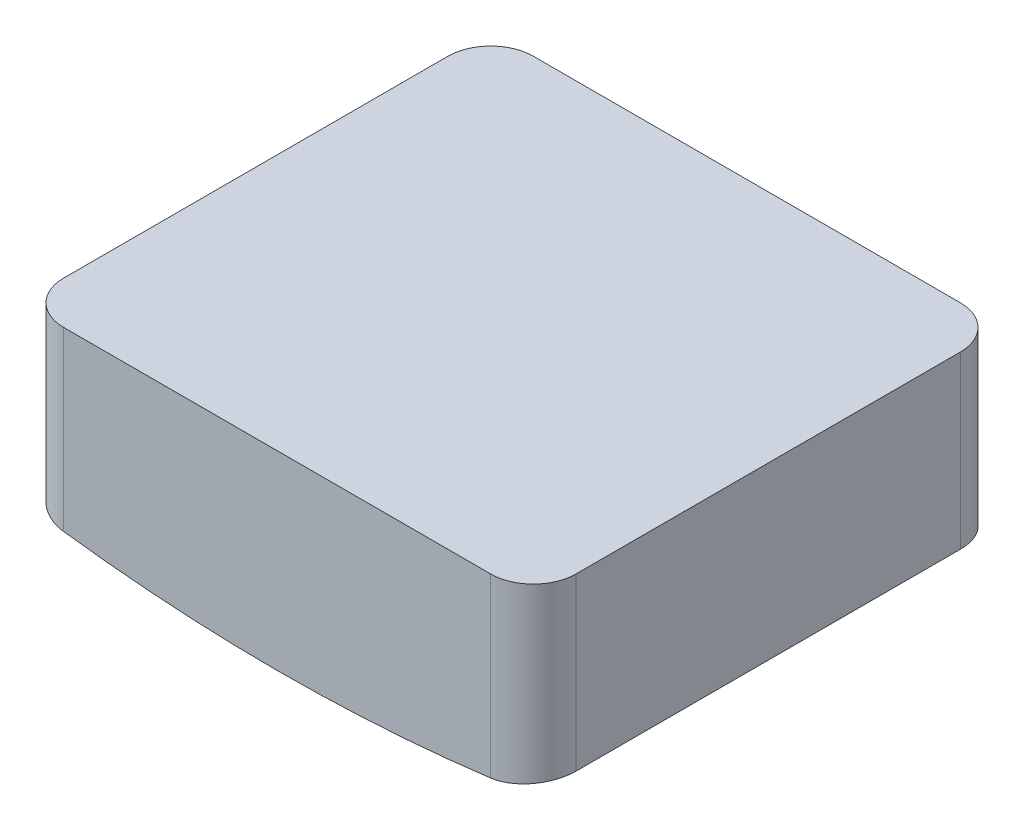
ISO-10303-21;
HEADER;
FILE_DESCRIPTION(('STEP AP214'),'2;1');
FILE_NAME('part.step','',(''),(''),'','','');
FILE_SCHEMA(('AUTOMOTIVE_DESIGN { 1 0 10303 214 1 1 1 1 }'));
ENDSEC;
DATA;
#1=APPLICATION_CONTEXT('core data for automotive mechanical design processes');
#2=APPLICATION_PROTOCOL_DEFINITION('international standard','automotive_design',2000,#1);
#3=PRODUCT_CONTEXT('',#1,'mechanical');
#4=PRODUCT('Part','Part','',(#3));
#5=PRODUCT_RELATED_PRODUCT_CATEGORY('part','',(#4));
#6=PRODUCT_DEFINITION_FORMATION('','',#4);
#7=PRODUCT_DEFINITION_CONTEXT('part definition',#1,'design');
#8=PRODUCT_DEFINITION('design','',#6,#7);
#9=PRODUCT_DEFINITION_SHAPE('','',#8);
#10=(LENGTH_UNIT() NAMED_UNIT(*) SI_UNIT(.MILLI.,.METRE.));
#11=(NAMED_UNIT(*) PLANE_ANGLE_UNIT() SI_UNIT($,.RADIAN.));
#12=(NAMED_UNIT(*) SI_UNIT($,.STERADIAN.) SOLID_ANGLE_UNIT());
#13=UNCERTAINTY_MEASURE_WITH_UNIT(LENGTH_MEASURE(1.E-05),#10,'distance_accuracy_value','');
#14=(GEOMETRIC_REPRESENTATION_CONTEXT(3) GLOBAL_UNCERTAINTY_ASSIGNED_CONTEXT((#13)) GLOBAL_UNIT_ASSIGNED_CONTEXT((#10,
#11,#12)) REPRESENTATION_CONTEXT('',''));
#15=CARTESIAN_POINT('',(0.,0.,0.));
#16=DIRECTION('',(0.,0.,1.));
#17=DIRECTION('',(1.,0.,0.));
#18=AXIS2_PLACEMENT_3D('',#15,#16,#17);
#19=CARTESIAN_POINT('',(31.567828207483,156.431270726947,5.));
#20=DIRECTION('',(0.,-1.,0.));
#21=DIRECTION('',(1.,0.,0.));
#22=AXIS2_PLACEMENT_3D('',#19,#20,#21);
#23=CYLINDRICAL_SURFACE('',#22,0.5);
#24=CARTESIAN_POINT('',(31.067828207483,136.910448510657,5.));
#25=CARTESIAN_POINT('',(31.0678032975781,136.910454043257,5.02790465586651));
#26=CARTESIAN_POINT('',(31.0701626651733,136.910089770888,5.05579993611413));
#27=CARTESIAN_POINT('',(31.0794634270095,136.908662918999,5.11076602421062));
#28=CARTESIAN_POINT('',(31.086399567339,136.907601140188,5.13783774023811));
#29=CARTESIAN_POINT('',(31.1046713242411,136.904819917588,5.19042768650378));
#30=CARTESIAN_POINT('',(31.1160084808209,136.903100243592,5.21594536933346));
#31=CARTESIAN_POINT('',(31.1427363332979,136.899078820125,5.26470631782095));
#32=CARTESIAN_POINT('',(31.1581267463067,136.896777111278,5.2879497420506));
#33=CARTESIAN_POINT('',(31.1926129354921,136.891671411549,5.33165153904714));
#34=CARTESIAN_POINT('',(31.2117288639906,136.88886469559,5.3520936857605));
#35=CARTESIAN_POINT('',(31.2530672182779,136.882867824658,5.38949003441723));
#36=CARTESIAN_POINT('',(31.2752903400118,136.879677583807,5.40644345285122));
#37=CARTESIAN_POINT('',(31.3224675104551,136.872997090204,5.43656617270208));
#38=CARTESIAN_POINT('',(31.3474483124578,136.869503984696,5.44969290197451));
#39=CARTESIAN_POINT('',(31.3992366962916,136.862371908969,5.47155692620132));
#40=CARTESIAN_POINT('',(31.426043390455,136.858733009979,5.48029633702002));
#41=CARTESIAN_POINT('',(31.4721261320835,136.852578506811,5.49113413004448));
#42=CARTESIAN_POINT('',(31.4911245310734,136.850068873877,5.49445602988902));
#43=CARTESIAN_POINT('',(31.5293542187095,136.84507596698,5.49888887726439));
#44=CARTESIAN_POINT('',(31.5485851554473,136.84259266181,5.50000282584829));
#45=CARTESIAN_POINT('',(31.567828207483,136.840137528482,5.5));
#46=B_SPLINE_CURVE_WITH_KNOTS('',3,(#24,#25,#26,#27,#28,#29,#30,#31,#32,#33,#34,#35,#36,#37,#38,
#39,#40,#41,#42,#43,#44,#45),.UNSPECIFIED.,.F.,.F.,(4,2,2,2,2,2,2,2,2,2,4),(0.,
0.0835981765681816,0.167100553081682,0.25063217519107,0.334157968931885,0.418148787090127,
0.502158447629228,0.587069869496855,0.671940301849044,0.730168364448781,0.788317228894858),.UNSPECIFIED.);
#47=CARTESIAN_POINT('',(31.067828207483,136.910448510657,5.));
#48=VERTEX_POINT('',#47);
#49=CARTESIAN_POINT('',(31.567828207483,136.840137528482,5.5));
#50=VERTEX_POINT('',#49);
#51=EDGE_CURVE('E21',#48,#50,#46,.T.);
#52=ORIENTED_EDGE('',*,*,#51,.T.);
#53=DIRECTION('',(0.,1.,0.));
#54=VECTOR('',#53,1.);
#55=CARTESIAN_POINT('',(31.5678282074829,156.431270726947,5.5));
#56=LINE('',#55,#54);
#57=CARTESIAN_POINT('',(31.5678282074829,138.910448510656,5.5));
#58=VERTEX_POINT('',#57);
#59=EDGE_CURVE('E132',#58,#50,#56,.F.);
#60=ORIENTED_EDGE('',*,*,#59,.F.);
#61=CARTESIAN_POINT('',(31.567828207483,138.910448510656,5.));
#62=DIRECTION('',(0.,-1.,0.));
#63=DIRECTION('',(1.,0.,0.));
#64=AXIS2_PLACEMENT_3D('',#61,#62,#63);
#65=CIRCLE('',#64,0.5);
#66=CARTESIAN_POINT('',(31.0678282074829,138.910448510656,5.));
#67=VERTEX_POINT('',#66);
#68=EDGE_CURVE('E143',#58,#67,#65,.T.);
#69=ORIENTED_EDGE('',*,*,#68,.T.);
#70=DIRECTION('',(0.,1.,0.));
#71=VECTOR('',#70,1.);
#72=CARTESIAN_POINT('',(31.0678282074829,138.910448510656,5.));
#73=LINE('',#72,#71);
#74=EDGE_CURVE('E116',#67,#48,#73,.F.);
#75=ORIENTED_EDGE('',*,*,#74,.T.);
#76=EDGE_LOOP('',(#52,#60,#69,#75));
#77=FACE_BOUND('',#76,.T.);
#78=ADVANCED_FACE('F17',(#77),#23,.T.);
#79=CARTESIAN_POINT('',(31.5678282074829,138.910448510656,0.5));
#80=DIRECTION('',(0.,1.,0.));
#81=DIRECTION('',(-1.,0.,0.));
#82=AXIS2_PLACEMENT_3D('',#79,#80,#81);
#83=CYLINDRICAL_SURFACE('',#82,0.5);
#84=CARTESIAN_POINT('',(31.567828207483,136.840137528482,0.));
#85=CARTESIAN_POINT('',(31.5394774338303,136.843752928276,-2.27791891081046E-05));
#86=CARTESIAN_POINT('',(31.5111422334126,136.84743362887,0.00240990943797193));
#87=CARTESIAN_POINT('',(31.4553040964931,136.854805641174,0.0120100811325862));
#88=CARTESIAN_POINT('',(31.4278006620447,136.858496945026,0.0191746702646636));
#89=CARTESIAN_POINT('',(31.3743775409306,136.865776660512,0.0380675220646654));
#90=CARTESIAN_POINT('',(31.348458636155,136.869365020892,0.049798017091667));
#91=CARTESIAN_POINT('',(31.2989617774437,136.876309666888,0.0774903425616476));
#92=CARTESIAN_POINT('',(31.2753833405934,136.879666000335,0.0934512976187248));
#93=CARTESIAN_POINT('',(31.2312943775798,136.886013701917,0.129126164369394));
#94=CARTESIAN_POINT('',(31.2107769227569,136.889005891387,0.148831363455944));
#95=CARTESIAN_POINT('',(31.1733446179727,136.894515019627,0.191475273877057));
#96=CARTESIAN_POINT('',(31.1564303728705,136.897031878596,0.21441452702929));
#97=CARTESIAN_POINT('',(31.1268470881303,136.901463950448,0.262660840213983));
#98=CARTESIAN_POINT('',(31.1141428712893,136.90338413996,0.28794589680137));
#99=CARTESIAN_POINT('',(31.0931728013977,136.90656743749,0.340323733079197));
#100=CARTESIAN_POINT('',(31.0849036449686,136.907831034538,0.367415150375042));
#101=CARTESIAN_POINT('',(31.0752717295329,136.909305674365,0.412249624095177));
#102=CARTESIAN_POINT('',(31.0724821441606,136.909733698535,0.429692035087494));
#103=CARTESIAN_POINT('',(31.0687607323034,136.910305192721,0.464753646070963));
#104=CARTESIAN_POINT('',(31.0678262993431,136.910449061971,0.482372563018321));
#105=CARTESIAN_POINT('',(31.0678282074829,136.910448510657,0.5));
#106=B_SPLINE_CURVE_WITH_KNOTS('',3,(#84,#85,#86,#87,#88,#89,#90,#91,#92,#93,#94,#95,#96,#97,
#98,#99,#100,#101,#102,#103,#104,#105),.UNSPECIFIED.,.F.,.F.,(4,2,2,2,2,2,2,2,2,2,4),(0.,
0.085627645082959,0.17120297044795,0.256820187894299,0.342419702851598,0.427822420056795,
0.513239462257654,0.597923658504689,0.682544691280089,0.735459468230943,0.788299847549629),.UNSPECIFIED.);
#107=CARTESIAN_POINT('',(31.567828207483,136.840137528482,0.));
#108=VERTEX_POINT('',#107);
#109=CARTESIAN_POINT('',(31.0678282074829,136.910448510657,0.5));
#110=VERTEX_POINT('',#109);
#111=EDGE_CURVE('E163',#108,#110,#106,.T.);
#112=ORIENTED_EDGE('',*,*,#111,.T.);
#113=DIRECTION('',(0.,1.,0.));
#114=VECTOR('',#113,1.);
#115=CARTESIAN_POINT('',(31.0678282074829,138.910448510656,0.5));
#116=LINE('',#115,#114);
#117=CARTESIAN_POINT('',(31.0678282074829,138.910448510656,0.5));
#118=VERTEX_POINT('',#117);
#119=EDGE_CURVE('E129',#110,#118,#116,.T.);
#120=ORIENTED_EDGE('',*,*,#119,.T.);
#121=CARTESIAN_POINT('',(31.5678282074829,138.910448510656,0.5));
#122=DIRECTION('',(0.,1.,0.));
#123=DIRECTION('',(-1.,0.,0.));
#124=AXIS2_PLACEMENT_3D('',#121,#122,#123);
#125=CIRCLE('',#124,0.5);
#126=CARTESIAN_POINT('',(31.5678282074829,138.910448510656,0.));
#127=VERTEX_POINT('',#126);
#128=EDGE_CURVE('E96',#118,#127,#125,.F.);
#129=ORIENTED_EDGE('',*,*,#128,.T.);
#130=DIRECTION('',(0.,1.,0.));
#131=VECTOR('',#130,1.);
#132=CARTESIAN_POINT('',(31.5678282074829,156.431270726947,0.));
#133=LINE('',#132,#131);
#134=EDGE_CURVE('E119',#127,#108,#133,.F.);
#135=ORIENTED_EDGE('',*,*,#134,.T.);
#136=EDGE_LOOP('',(#112,#120,#129,#135));
#137=FACE_BOUND('',#136,.T.);
#138=ADVANCED_FACE('F167',(#137),#83,.T.);
#139=CARTESIAN_POINT('',(36.5678282074829,156.431270726947,5.));
#140=DIRECTION('',(0.,1.,0.));
#141=DIRECTION('',(0.,0.,1.));
#142=AXIS2_PLACEMENT_3D('',#139,#140,#141);
#143=CYLINDRICAL_SURFACE('',#142,0.5);
#144=CARTESIAN_POINT('',(36.5678282074829,138.910448510656,5.));
#145=DIRECTION('',(0.,1.,0.));
#146=DIRECTION('',(0.,0.,1.));
#147=AXIS2_PLACEMENT_3D('',#144,#145,#146);
#148=CIRCLE('',#147,0.5);
#149=CARTESIAN_POINT('',(37.0678282074829,138.910448510656,5.));
#150=VERTEX_POINT('',#149);
#151=CARTESIAN_POINT('',(36.5678282074829,138.910448510656,5.5));
#152=VERTEX_POINT('',#151);
#153=EDGE_CURVE('E211',#150,#152,#148,.F.);
#154=ORIENTED_EDGE('',*,*,#153,.T.);
#155=DIRECTION('',(0.,1.,0.));
#156=VECTOR('',#155,1.);
#157=CARTESIAN_POINT('',(36.5678282074829,156.431270726947,5.5));
#158=LINE('',#157,#156);
#159=CARTESIAN_POINT('',(36.5678282074828,136.840137528482,5.5));
#160=VERTEX_POINT('',#159);
#161=EDGE_CURVE('E204',#160,#152,#158,.T.);
#162=ORIENTED_EDGE('',*,*,#161,.F.);
#163=CARTESIAN_POINT('',(36.5678282074828,136.840137528482,5.5));
#164=CARTESIAN_POINT('',(36.5961789811355,136.843752928276,5.50002277918911));
#165=CARTESIAN_POINT('',(36.6245141815532,136.84743362887,5.49759009056203));
#166=CARTESIAN_POINT('',(36.6803523184727,136.854805641174,5.48798991886741));
#167=CARTESIAN_POINT('',(36.7078557529211,136.858496945026,5.48082532973534));
#168=CARTESIAN_POINT('',(36.7612788740352,136.865776660512,5.46193247793533));
#169=CARTESIAN_POINT('',(36.7871977788108,136.869365020892,5.45020198290833));
#170=CARTESIAN_POINT('',(36.8366946375221,136.876309666888,5.42250965743835));
#171=CARTESIAN_POINT('',(36.8602730743724,136.879666000335,5.40654870238127));
#172=CARTESIAN_POINT('',(36.904362037386,136.886013701917,5.3708738356306));
#173=CARTESIAN_POINT('',(36.9248794922089,136.889005891387,5.35116863654405));
#174=CARTESIAN_POINT('',(36.9623117969931,136.894515019627,5.30852472612294));
#175=CARTESIAN_POINT('',(36.9792260420953,136.897031878596,5.2855854729707));
#176=CARTESIAN_POINT('',(37.0088093268355,136.901463950448,5.23733915978601));
#177=CARTESIAN_POINT('',(37.0215135436764,136.90338413996,5.21205410319863));
#178=CARTESIAN_POINT('',(37.0424836135681,136.90656743749,5.1596762669208));
#179=CARTESIAN_POINT('',(37.0507527699971,136.907831034538,5.13258484962495));
#180=CARTESIAN_POINT('',(37.0603846854329,136.909305674365,5.08775037590482));
#181=CARTESIAN_POINT('',(37.0631742708052,136.909733698535,5.0703079649125));
#182=CARTESIAN_POINT('',(37.0668956826624,136.910305192721,5.03524635392904));
#183=CARTESIAN_POINT('',(37.0678301156227,136.910449061971,5.01762743698168));
#184=CARTESIAN_POINT('',(37.0678282074829,136.910448510657,5.));
#185=B_SPLINE_CURVE_WITH_KNOTS('',3,(#163,#164,#165,#166,#167,#168,#169,#170,#171,#172,#173,
#174,#175,#176,#177,#178,#179,#180,#181,#182,#183,#184),.UNSPECIFIED.,.F.,.F.,(4,2,2,2,2,2,2,2,
2,2,4),(0.,0.0856276450829589,0.171202970447957,0.256820187894306,0.342419702851605,
0.427822420056807,0.513239462257661,0.597923658504699,0.682544691280097,0.735459468230948,
0.788299847549631),.UNSPECIFIED.);
#186=CARTESIAN_POINT('',(37.0678282074829,136.910448510657,5.));
#187=VERTEX_POINT('',#186);
#188=EDGE_CURVE('E40',#160,#187,#185,.T.);
#189=ORIENTED_EDGE('',*,*,#188,.T.);
#190=DIRECTION('',(0.,1.,0.));
#191=VECTOR('',#190,1.);
#192=CARTESIAN_POINT('',(37.0678282074829,136.910448510656,5.));
#193=LINE('',#192,#191);
#194=EDGE_CURVE('E121',#187,#150,#193,.T.);
#195=ORIENTED_EDGE('',*,*,#194,.T.);
#196=EDGE_LOOP('',(#154,#162,#189,#195));
#197=FACE_BOUND('',#196,.T.);
#198=ADVANCED_FACE('F170',(#197),#143,.T.);
#199=CARTESIAN_POINT('',(37.0678282074829,138.910448510656,5.5));
#200=DIRECTION('',(0.,-1.,0.));
#201=DIRECTION('',(0.,0.,-1.));
#202=AXIS2_PLACEMENT_3D('',#199,#200,#201);
#203=PLANE('',#202);
#204=ORIENTED_EDGE('',*,*,#68,.F.);
#205=DIRECTION('',(1.,0.,0.));
#206=VECTOR('',#205,1.);
#207=CARTESIAN_POINT('',(34.0678282074829,138.910448510656,5.5));
#208=LINE('',#207,#206);
#209=EDGE_CURVE('E107',#152,#58,#208,.F.);
#210=ORIENTED_EDGE('',*,*,#209,.F.);
#211=ORIENTED_EDGE('',*,*,#153,.F.);
#212=DIRECTION('',(0.,0.,1.));
#213=VECTOR('',#212,1.);
#214=CARTESIAN_POINT('',(37.0678282074829,138.910448510656,5.5));
#215=LINE('',#214,#213);
#216=CARTESIAN_POINT('',(37.0678282074829,138.910448510656,0.5));
#217=VERTEX_POINT('',#216);
#218=EDGE_CURVE('E72',#150,#217,#215,.F.);
#219=ORIENTED_EDGE('',*,*,#218,.T.);
#220=CARTESIAN_POINT('',(36.5678282074829,138.910448510656,0.5));
#221=DIRECTION('',(0.,-1.,0.));
#222=DIRECTION('',(0.,0.,-1.));
#223=AXIS2_PLACEMENT_3D('',#220,#221,#222);
#224=CIRCLE('',#223,0.5);
#225=CARTESIAN_POINT('',(36.5678282074829,138.910448510656,0.));
#226=VERTEX_POINT('',#225);
#227=EDGE_CURVE('E98',#226,#217,#224,.T.);
#228=ORIENTED_EDGE('',*,*,#227,.F.);
#229=DIRECTION('',(1.,0.,0.));
#230=VECTOR('',#229,1.);
#231=CARTESIAN_POINT('',(34.0678282074829,138.910448510656,0.));
#232=LINE('',#231,#230);
#233=EDGE_CURVE('E102',#226,#127,#232,.F.);
#234=ORIENTED_EDGE('',*,*,#233,.T.);
#235=ORIENTED_EDGE('',*,*,#128,.F.);
#236=DIRECTION('',(0.,0.,1.));
#237=VECTOR('',#236,1.);
#238=CARTESIAN_POINT('',(31.0678282074829,138.910448510656,5.5));
#239=LINE('',#238,#237);
#240=EDGE_CURVE('E126',#118,#67,#239,.T.);
#241=ORIENTED_EDGE('',*,*,#240,.T.);
#242=EDGE_LOOP('',(#204,#210,#211,#219,#228,#234,#235,#241));
#243=FACE_BOUND('',#242,.T.);
#244=ADVANCED_FACE('F100',(#243),#203,.F.);
#245=CARTESIAN_POINT('',(36.5678282074829,136.910448510656,0.5));
#246=DIRECTION('',(0.,-1.,0.));
#247=DIRECTION('',(0.,0.,-1.));
#248=AXIS2_PLACEMENT_3D('',#245,#246,#247);
#249=CYLINDRICAL_SURFACE('',#248,0.5);
#250=ORIENTED_EDGE('',*,*,#227,.T.);
#251=DIRECTION('',(0.,1.,0.));
#252=VECTOR('',#251,1.);
#253=CARTESIAN_POINT('',(37.0678282074829,136.910448510656,0.5));
#254=LINE('',#253,#252);
#255=CARTESIAN_POINT('',(37.0678282074829,136.910448510657,0.5));
#256=VERTEX_POINT('',#255);
#257=EDGE_CURVE('E136',#217,#256,#254,.F.);
#258=ORIENTED_EDGE('',*,*,#257,.T.);
#259=CARTESIAN_POINT('',(37.0678282074829,136.910448510657,0.5));
#260=CARTESIAN_POINT('',(37.0678531173878,136.910454043257,0.472095344133494));
#261=CARTESIAN_POINT('',(37.0654937497925,136.910089770888,0.444200063885875));
#262=CARTESIAN_POINT('',(37.0561929879563,136.908662918999,0.389233975789379));
#263=CARTESIAN_POINT('',(37.0492568476269,136.907601140188,0.36216225976189));
#264=CARTESIAN_POINT('',(37.0309850907248,136.904819917588,0.309572313496224));
#265=CARTESIAN_POINT('',(37.0196479341449,136.903100243592,0.284054630666539));
#266=CARTESIAN_POINT('',(36.9929200816679,136.899078820125,0.235293682179055));
#267=CARTESIAN_POINT('',(36.9775296686592,136.896777111278,0.212050257949402));
#268=CARTESIAN_POINT('',(36.9430434794738,136.891671411549,0.168348460952857));
#269=CARTESIAN_POINT('',(36.9239275509753,136.88886469559,0.147906314239496));
#270=CARTESIAN_POINT('',(36.882589196688,136.882867824658,0.110509965582767));
#271=CARTESIAN_POINT('',(36.860366074954,136.879677583807,0.093556547148784));
#272=CARTESIAN_POINT('',(36.8131889045108,136.872997090204,0.0634338272979286));
#273=CARTESIAN_POINT('',(36.788208102508,136.869503984696,0.0503070980254963));
#274=CARTESIAN_POINT('',(36.7364197186743,136.862371908969,0.0284430737986796));
#275=CARTESIAN_POINT('',(36.7096130245109,136.858733009979,0.0197036629799814));
#276=CARTESIAN_POINT('',(36.6635302828823,136.852578506811,0.0088658699555184));
#277=CARTESIAN_POINT('',(36.6445318838924,136.850068873877,0.00554397011098125));
#278=CARTESIAN_POINT('',(36.6063021962563,136.84507596698,0.00111112273560245));
#279=CARTESIAN_POINT('',(36.5870712595185,136.84259266181,-2.82584828942312E-06));
#280=CARTESIAN_POINT('',(36.5678282074828,136.840137528482,0.));
#281=B_SPLINE_CURVE_WITH_KNOTS('',3,(#259,#260,#261,#262,#263,#264,#265,#266,#267,#268,#269,
#270,#271,#272,#273,#274,#275,#276,#277,#278,#279,#280),.UNSPECIFIED.,.F.,.F.,(4,2,2,2,2,2,2,2,
2,2,4),(0.,0.0835981765681808,0.167100553081682,0.250632175191069,0.334157968931889,
0.418148787090127,0.502158447629227,0.587069869496846,0.671940301849046,0.730168364448823,
0.788317228894928),.UNSPECIFIED.);
#282=CARTESIAN_POINT('',(36.5678282074828,136.840137528482,0.));
#283=VERTEX_POINT('',#282);
#284=EDGE_CURVE('E108',#256,#283,#281,.T.);
#285=ORIENTED_EDGE('',*,*,#284,.T.);
#286=DIRECTION('',(0.,1.,0.));
#287=VECTOR('',#286,1.);
#288=CARTESIAN_POINT('',(36.5678282074829,156.431270726947,0.));
#289=LINE('',#288,#287);
#290=EDGE_CURVE('E111',#283,#226,#289,.T.);
#291=ORIENTED_EDGE('',*,*,#290,.T.);
#292=EDGE_LOOP('',(#250,#258,#285,#291));
#293=FACE_BOUND('',#292,.T.);
#294=ADVANCED_FACE('F112',(#293),#249,.T.);
#295=CARTESIAN_POINT('',(34.0678282074829,156.431270726947,5.5));
#296=DIRECTION('',(0.,0.,1.));
#297=DIRECTION('',(1.,0.,0.));
#298=AXIS2_PLACEMENT_3D('',#295,#296,#297);
#299=PLANE('',#298);
#300=CARTESIAN_POINT('',(34.0678282074829,156.431270726947,5.5));
#301=DIRECTION('',(0.,0.,1.));
#302=DIRECTION('',(1.,0.,0.));
#303=AXIS2_PLACEMENT_3D('',#300,#301,#302);
#304=CIRCLE('',#303,19.75);
#305=EDGE_CURVE('E135',#160,#50,#304,.F.);
#306=ORIENTED_EDGE('',*,*,#305,.F.);
#307=ORIENTED_EDGE('',*,*,#161,.T.);
#308=ORIENTED_EDGE('',*,*,#209,.T.);
#309=ORIENTED_EDGE('',*,*,#59,.T.);
#310=EDGE_LOOP('',(#306,#307,#308,#309));
#311=FACE_BOUND('',#310,.T.);
#312=ADVANCED_FACE('F178',(#311),#299,.T.);
#313=CARTESIAN_POINT('',(31.0678282074829,138.910448510656,5.5));
#314=DIRECTION('',(1.,0.,0.));
#315=DIRECTION('',(0.,1.,0.));
#316=AXIS2_PLACEMENT_3D('',#313,#314,#315);
#317=PLANE('',#316);
#318=ORIENTED_EDGE('',*,*,#74,.F.);
#319=ORIENTED_EDGE('',*,*,#240,.F.);
#320=ORIENTED_EDGE('',*,*,#119,.F.);
#321=DIRECTION('',(0.,0.,1.));
#322=VECTOR('',#321,1.);
#323=CARTESIAN_POINT('',(31.0678282074831,136.910448510657,5.5));
#324=LINE('',#323,#322);
#325=EDGE_CURVE('E134',#48,#110,#324,.F.);
#326=ORIENTED_EDGE('',*,*,#325,.F.);
#327=EDGE_LOOP('',(#318,#319,#320,#326));
#328=FACE_BOUND('',#327,.T.);
#329=ADVANCED_FACE('F182',(#328),#317,.F.);
#330=CARTESIAN_POINT('',(34.0678282074829,156.431270726947,0.));
#331=DIRECTION('',(0.,0.,1.));
#332=DIRECTION('',(1.,0.,0.));
#333=AXIS2_PLACEMENT_3D('',#330,#331,#332);
#334=PLANE('',#333);
#335=ORIENTED_EDGE('',*,*,#134,.F.);
#336=ORIENTED_EDGE('',*,*,#233,.F.);
#337=ORIENTED_EDGE('',*,*,#290,.F.);
#338=CARTESIAN_POINT('',(34.0678282074829,156.431270726947,0.));
#339=DIRECTION('',(0.,0.,1.));
#340=DIRECTION('',(1.,0.,0.));
#341=AXIS2_PLACEMENT_3D('',#338,#339,#340);
#342=CIRCLE('',#341,19.75);
#343=EDGE_CURVE('E31',#108,#283,#342,.T.);
#344=ORIENTED_EDGE('',*,*,#343,.F.);
#345=EDGE_LOOP('',(#335,#336,#337,#344));
#346=FACE_BOUND('',#345,.T.);
#347=ADVANCED_FACE('F118',(#346),#334,.F.);
#348=CARTESIAN_POINT('',(37.0678282074829,136.910448510656,5.5));
#349=DIRECTION('',(-1.,0.,0.));
#350=DIRECTION('',(0.,0.,1.));
#351=AXIS2_PLACEMENT_3D('',#348,#349,#350);
#352=PLANE('',#351);
#353=ORIENTED_EDGE('',*,*,#257,.F.);
#354=ORIENTED_EDGE('',*,*,#218,.F.);
#355=ORIENTED_EDGE('',*,*,#194,.F.);
#356=DIRECTION('',(0.,0.,1.));
#357=VECTOR('',#356,1.);
#358=CARTESIAN_POINT('',(37.0678282074827,136.910448510657,5.5));
#359=LINE('',#358,#357);
#360=EDGE_CURVE('E11',#256,#187,#359,.T.);
#361=ORIENTED_EDGE('',*,*,#360,.F.);
#362=EDGE_LOOP('',(#353,#354,#355,#361));
#363=FACE_BOUND('',#362,.T.);
#364=ADVANCED_FACE('F152',(#363),#352,.F.);
#365=CARTESIAN_POINT('',(34.0678282074829,156.431270726947,5.5));
#366=DIRECTION('',(0.,0.,1.));
#367=DIRECTION('',(1.,0.,0.));
#368=AXIS2_PLACEMENT_3D('',#365,#366,#367);
#369=CYLINDRICAL_SURFACE('',#368,19.75);
#370=ORIENTED_EDGE('',*,*,#360,.T.);
#371=ORIENTED_EDGE('',*,*,#188,.F.);
#372=ORIENTED_EDGE('',*,*,#305,.T.);
#373=ORIENTED_EDGE('',*,*,#51,.F.);
#374=ORIENTED_EDGE('',*,*,#325,.T.);
#375=ORIENTED_EDGE('',*,*,#111,.F.);
#376=ORIENTED_EDGE('',*,*,#343,.T.);
#377=ORIENTED_EDGE('',*,*,#284,.F.);
#378=EDGE_LOOP('',(#370,#371,#372,#373,#374,#375,#376,#377));
#379=FACE_BOUND('',#378,.T.);
#380=ADVANCED_FACE('F148',(#379),#369,.T.);
#381=CLOSED_SHELL('',(#78,#138,#198,#244,#294,#312,#329,#347,#364,#380));
#382=MANIFOLD_SOLID_BREP('B1',#381);
#383=ADVANCED_BREP_SHAPE_REPRESENTATION('',(#18,#382),#14);
#384=SHAPE_DEFINITION_REPRESENTATION(#9,#383);
ENDSEC;
END-ISO-10303-21;
